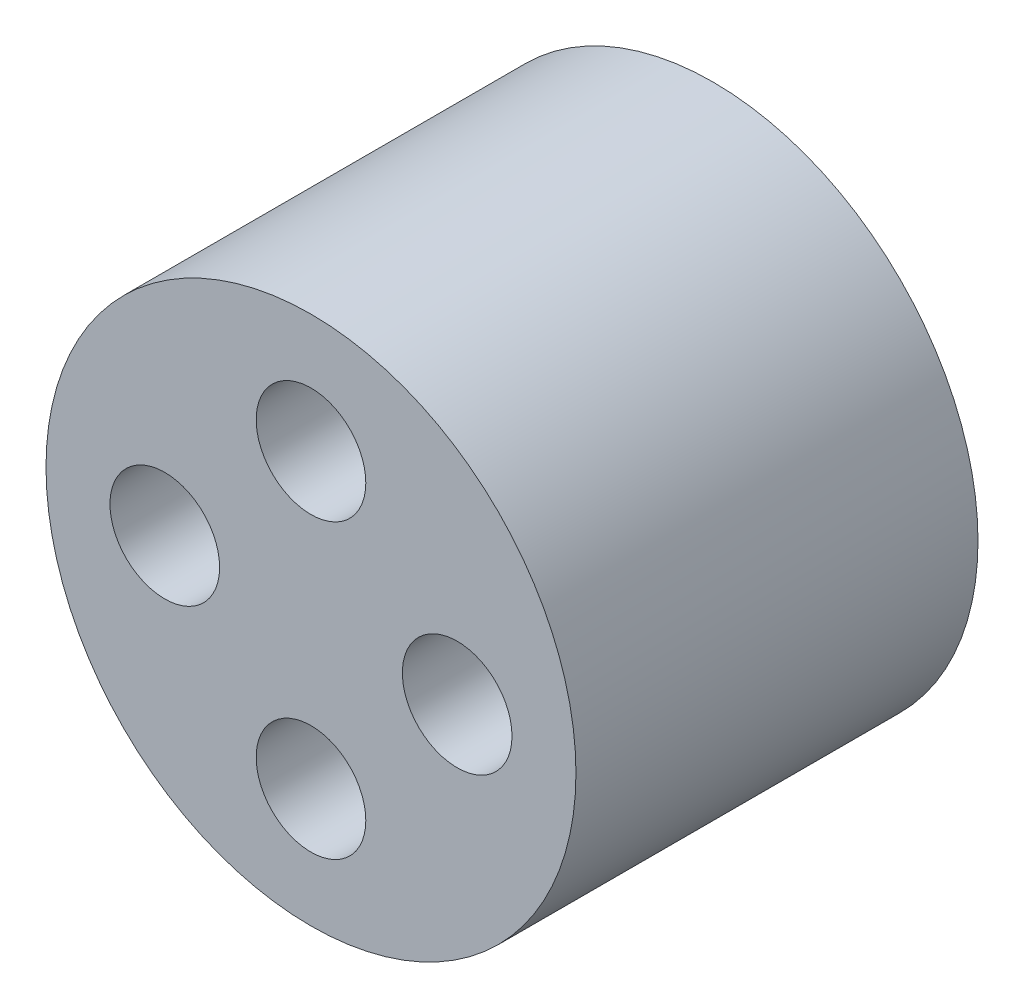
ISO-10303-21;
HEADER;
FILE_DESCRIPTION(('STEP AP214'),'2;1');
FILE_NAME('part.step','',(''),(''),'','','');
FILE_SCHEMA(('AUTOMOTIVE_DESIGN { 1 0 10303 214 1 1 1 1 }'));
ENDSEC;
DATA;
#1=APPLICATION_CONTEXT('core data for automotive mechanical design processes');
#2=APPLICATION_PROTOCOL_DEFINITION('international standard','automotive_design',2000,#1);
#3=PRODUCT_CONTEXT('',#1,'mechanical');
#4=PRODUCT('Part','Part','',(#3));
#5=PRODUCT_RELATED_PRODUCT_CATEGORY('part','',(#4));
#6=PRODUCT_DEFINITION_FORMATION('','',#4);
#7=PRODUCT_DEFINITION_CONTEXT('part definition',#1,'design');
#8=PRODUCT_DEFINITION('design','',#6,#7);
#9=PRODUCT_DEFINITION_SHAPE('','',#8);
#10=(LENGTH_UNIT() NAMED_UNIT(*) SI_UNIT(.MILLI.,.METRE.));
#11=(NAMED_UNIT(*) PLANE_ANGLE_UNIT() SI_UNIT($,.RADIAN.));
#12=(NAMED_UNIT(*) SI_UNIT($,.STERADIAN.) SOLID_ANGLE_UNIT());
#13=UNCERTAINTY_MEASURE_WITH_UNIT(LENGTH_MEASURE(1.E-05),#10,'distance_accuracy_value','');
#14=(GEOMETRIC_REPRESENTATION_CONTEXT(3) GLOBAL_UNCERTAINTY_ASSIGNED_CONTEXT((#13)) GLOBAL_UNIT_ASSIGNED_CONTEXT((#10,
#11,#12)) REPRESENTATION_CONTEXT('',''));
#15=CARTESIAN_POINT('',(0.,0.,0.));
#16=DIRECTION('',(0.,0.,1.));
#17=DIRECTION('',(1.,0.,0.));
#18=AXIS2_PLACEMENT_3D('',#15,#16,#17);
#19=CARTESIAN_POINT('',(-8.,0.,22.));
#20=DIRECTION('',(0.,0.,-1.));
#21=DIRECTION('',(-1.,0.,0.));
#22=AXIS2_PLACEMENT_3D('',#19,#20,#21);
#23=CYLINDRICAL_SURFACE('',#22,1.5);
#24=CARTESIAN_POINT('',(-8.,0.,0.));
#25=DIRECTION('',(0.,0.,1.));
#26=DIRECTION('',(1.,0.,0.));
#27=AXIS2_PLACEMENT_3D('',#24,#25,#26);
#28=CIRCLE('',#27,1.5);
#29=CARTESIAN_POINT('',(-6.5,0.,0.));
#30=VERTEX_POINT('',#29);
#31=EDGE_CURVE('E54',#30,#30,#28,.T.);
#32=ORIENTED_EDGE('',*,*,#31,.F.);
#33=EDGE_LOOP('',(#32));
#34=FACE_BOUND('',#33,.T.);
#35=CARTESIAN_POINT('',(-8.,0.,5.));
#36=DIRECTION('',(0.,0.,1.));
#37=DIRECTION('',(1.,0.,0.));
#38=AXIS2_PLACEMENT_3D('',#35,#36,#37);
#39=CIRCLE('',#38,1.5);
#40=CARTESIAN_POINT('',(-6.5,0.,5.));
#41=VERTEX_POINT('',#40);
#42=EDGE_CURVE('E45',#41,#41,#39,.T.);
#43=ORIENTED_EDGE('',*,*,#42,.T.);
#44=EDGE_LOOP('',(#43));
#45=FACE_BOUND('',#44,.T.);
#46=ADVANCED_FACE('F41',(#34,#45),#23,.F.);
#47=CARTESIAN_POINT('',(0.,-8.,22.));
#48=DIRECTION('',(0.,0.,-1.));
#49=DIRECTION('',(-1.,0.,0.));
#50=AXIS2_PLACEMENT_3D('',#47,#48,#49);
#51=CYLINDRICAL_SURFACE('',#50,1.5);
#52=CARTESIAN_POINT('',(0.,-8.,0.));
#53=DIRECTION('',(0.,0.,1.));
#54=DIRECTION('',(1.,0.,0.));
#55=AXIS2_PLACEMENT_3D('',#52,#53,#54);
#56=CIRCLE('',#55,1.5);
#57=CARTESIAN_POINT('',(1.49999999999997,-8.,0.));
#58=VERTEX_POINT('',#57);
#59=EDGE_CURVE('E66',#58,#58,#56,.T.);
#60=ORIENTED_EDGE('',*,*,#59,.F.);
#61=EDGE_LOOP('',(#60));
#62=FACE_BOUND('',#61,.T.);
#63=CARTESIAN_POINT('',(0.,-8.,5.));
#64=DIRECTION('',(0.,0.,1.));
#65=DIRECTION('',(1.,0.,0.));
#66=AXIS2_PLACEMENT_3D('',#63,#64,#65);
#67=CIRCLE('',#66,1.5);
#68=CARTESIAN_POINT('',(1.49999999999997,-8.,5.));
#69=VERTEX_POINT('',#68);
#70=EDGE_CURVE('E77',#69,#69,#67,.T.);
#71=ORIENTED_EDGE('',*,*,#70,.T.);
#72=EDGE_LOOP('',(#71));
#73=FACE_BOUND('',#72,.T.);
#74=ADVANCED_FACE('F138',(#62,#73),#51,.F.);
#75=CARTESIAN_POINT('',(8.,0.,22.));
#76=DIRECTION('',(0.,0.,-1.));
#77=DIRECTION('',(-1.,0.,0.));
#78=AXIS2_PLACEMENT_3D('',#75,#76,#77);
#79=CYLINDRICAL_SURFACE('',#78,1.5);
#80=CARTESIAN_POINT('',(8.,0.,0.));
#81=DIRECTION('',(0.,0.,1.));
#82=DIRECTION('',(1.,0.,0.));
#83=AXIS2_PLACEMENT_3D('',#80,#81,#82);
#84=CIRCLE('',#83,1.5);
#85=CARTESIAN_POINT('',(9.5,0.,0.));
#86=VERTEX_POINT('',#85);
#87=EDGE_CURVE('E63',#86,#86,#84,.T.);
#88=ORIENTED_EDGE('',*,*,#87,.F.);
#89=EDGE_LOOP('',(#88));
#90=FACE_BOUND('',#89,.T.);
#91=CARTESIAN_POINT('',(8.,0.,5.));
#92=DIRECTION('',(0.,0.,1.));
#93=DIRECTION('',(1.,0.,0.));
#94=AXIS2_PLACEMENT_3D('',#91,#92,#93);
#95=CIRCLE('',#94,1.5);
#96=CARTESIAN_POINT('',(9.5,0.,5.));
#97=VERTEX_POINT('',#96);
#98=EDGE_CURVE('E74',#97,#97,#95,.T.);
#99=ORIENTED_EDGE('',*,*,#98,.T.);
#100=EDGE_LOOP('',(#99));
#101=FACE_BOUND('',#100,.T.);
#102=ADVANCED_FACE('F144',(#90,#101),#79,.F.);
#103=CARTESIAN_POINT('',(0.,8.,22.));
#104=DIRECTION('',(0.,0.,-1.));
#105=DIRECTION('',(-1.,0.,0.));
#106=AXIS2_PLACEMENT_3D('',#103,#104,#105);
#107=CYLINDRICAL_SURFACE('',#106,1.5);
#108=CARTESIAN_POINT('',(0.,8.,0.));
#109=DIRECTION('',(0.,0.,1.));
#110=DIRECTION('',(1.,0.,0.));
#111=AXIS2_PLACEMENT_3D('',#108,#109,#110);
#112=CIRCLE('',#111,1.5);
#113=CARTESIAN_POINT('',(1.50000000000008,8.,0.));
#114=VERTEX_POINT('',#113);
#115=EDGE_CURVE('E60',#114,#114,#112,.T.);
#116=ORIENTED_EDGE('',*,*,#115,.F.);
#117=EDGE_LOOP('',(#116));
#118=FACE_BOUND('',#117,.T.);
#119=CARTESIAN_POINT('',(0.,8.,5.));
#120=DIRECTION('',(0.,0.,1.));
#121=DIRECTION('',(1.,0.,0.));
#122=AXIS2_PLACEMENT_3D('',#119,#120,#121);
#123=CIRCLE('',#122,1.5);
#124=CARTESIAN_POINT('',(1.50000000000008,8.,5.));
#125=VERTEX_POINT('',#124);
#126=EDGE_CURVE('E71',#125,#125,#123,.T.);
#127=ORIENTED_EDGE('',*,*,#126,.T.);
#128=EDGE_LOOP('',(#127));
#129=FACE_BOUND('',#128,.T.);
#130=ADVANCED_FACE('F43',(#118,#129),#107,.F.);
#131=CARTESIAN_POINT('',(0.,0.,22.));
#132=DIRECTION('',(0.,0.,-1.));
#133=DIRECTION('',(-1.,0.,0.));
#134=AXIS2_PLACEMENT_3D('',#131,#132,#133);
#135=CYLINDRICAL_SURFACE('',#134,14.5);
#136=CARTESIAN_POINT('',(0.,0.,22.));
#137=DIRECTION('',(0.,0.,1.));
#138=DIRECTION('',(1.,0.,0.));
#139=AXIS2_PLACEMENT_3D('',#136,#137,#138);
#140=CIRCLE('',#139,14.5);
#141=CARTESIAN_POINT('',(14.5,0.,22.));
#142=VERTEX_POINT('',#141);
#143=EDGE_CURVE('E11',#142,#142,#140,.T.);
#144=ORIENTED_EDGE('',*,*,#143,.F.);
#145=EDGE_LOOP('',(#144));
#146=FACE_BOUND('',#145,.T.);
#147=CARTESIAN_POINT('',(0.,0.,0.));
#148=DIRECTION('',(0.,0.,1.));
#149=DIRECTION('',(1.,0.,0.));
#150=AXIS2_PLACEMENT_3D('',#147,#148,#149);
#151=CIRCLE('',#150,14.5);
#152=CARTESIAN_POINT('',(14.5,0.,0.));
#153=VERTEX_POINT('',#152);
#154=EDGE_CURVE('E49',#153,#153,#151,.T.);
#155=ORIENTED_EDGE('',*,*,#154,.T.);
#156=EDGE_LOOP('',(#155));
#157=FACE_BOUND('',#156,.T.);
#158=ADVANCED_FACE('F121',(#146,#157),#135,.T.);
#159=CARTESIAN_POINT('',(0.,0.,22.));
#160=DIRECTION('',(0.,0.,1.));
#161=DIRECTION('',(1.,0.,0.));
#162=AXIS2_PLACEMENT_3D('',#159,#160,#161);
#163=PLANE('',#162);
#164=CARTESIAN_POINT('',(0.,8.,22.));
#165=DIRECTION('',(0.,0.,1.));
#166=DIRECTION('',(1.,0.,0.));
#167=AXIS2_PLACEMENT_3D('',#164,#165,#166);
#168=CIRCLE('',#167,3.);
#169=CARTESIAN_POINT('',(3.00000000000008,8.,22.));
#170=VERTEX_POINT('',#169);
#171=EDGE_CURVE('E107',#170,#170,#168,.T.);
#172=ORIENTED_EDGE('',*,*,#171,.F.);
#173=EDGE_LOOP('',(#172));
#174=FACE_BOUND('',#173,.T.);
#175=CARTESIAN_POINT('',(8.,-1.1172740284298E-13,22.));
#176=DIRECTION('',(0.,0.,1.));
#177=DIRECTION('',(1.,0.,0.));
#178=AXIS2_PLACEMENT_3D('',#175,#176,#177);
#179=CIRCLE('',#178,3.);
#180=CARTESIAN_POINT('',(11.,-1.1172740284298E-13,22.));
#181=VERTEX_POINT('',#180);
#182=EDGE_CURVE('E104',#181,#181,#179,.T.);
#183=ORIENTED_EDGE('',*,*,#182,.F.);
#184=EDGE_LOOP('',(#183));
#185=FACE_BOUND('',#184,.T.);
#186=CARTESIAN_POINT('',(-1.39659253553725E-13,-8.,22.));
#187=DIRECTION('',(0.,0.,1.));
#188=DIRECTION('',(1.,0.,0.));
#189=AXIS2_PLACEMENT_3D('',#186,#187,#188);
#190=CIRCLE('',#189,3.);
#191=CARTESIAN_POINT('',(2.99999999999986,-8.,22.));
#192=VERTEX_POINT('',#191);
#193=EDGE_CURVE('E98',#192,#192,#190,.T.);
#194=ORIENTED_EDGE('',*,*,#193,.F.);
#195=EDGE_LOOP('',(#194));
#196=FACE_BOUND('',#195,.T.);
#197=CARTESIAN_POINT('',(-8.,1.69325827740447E-13,22.));
#198=DIRECTION('',(0.,0.,1.));
#199=DIRECTION('',(1.,0.,0.));
#200=AXIS2_PLACEMENT_3D('',#197,#198,#199);
#201=CIRCLE('',#200,3.);
#202=CARTESIAN_POINT('',(-5.,1.69325827740447E-13,22.));
#203=VERTEX_POINT('',#202);
#204=EDGE_CURVE('E58',#203,#203,#201,.T.);
#205=ORIENTED_EDGE('',*,*,#204,.F.);
#206=EDGE_LOOP('',(#205));
#207=FACE_BOUND('',#206,.T.);
#208=ORIENTED_EDGE('',*,*,#143,.T.);
#209=EDGE_LOOP('',(#208));
#210=FACE_BOUND('',#209,.T.);
#211=ADVANCED_FACE('F117',(#174,#185,#196,#207,#210),#163,.T.);
#212=CARTESIAN_POINT('',(0.,0.,0.));
#213=DIRECTION('',(0.,0.,1.));
#214=DIRECTION('',(1.,0.,0.));
#215=AXIS2_PLACEMENT_3D('',#212,#213,#214);
#216=PLANE('',#215);
#217=ORIENTED_EDGE('',*,*,#115,.T.);
#218=EDGE_LOOP('',(#217));
#219=FACE_BOUND('',#218,.T.);
#220=ORIENTED_EDGE('',*,*,#87,.T.);
#221=EDGE_LOOP('',(#220));
#222=FACE_BOUND('',#221,.T.);
#223=ORIENTED_EDGE('',*,*,#59,.T.);
#224=EDGE_LOOP('',(#223));
#225=FACE_BOUND('',#224,.T.);
#226=ORIENTED_EDGE('',*,*,#31,.T.);
#227=EDGE_LOOP('',(#226));
#228=FACE_BOUND('',#227,.T.);
#229=ORIENTED_EDGE('',*,*,#154,.F.);
#230=EDGE_LOOP('',(#229));
#231=FACE_BOUND('',#230,.T.);
#232=ADVANCED_FACE('F120',(#219,#222,#225,#228,#231),#216,.F.);
#233=CARTESIAN_POINT('',(-8.,1.69325827740447E-13,-8.48528137423857));
#234=DIRECTION('',(0.,0.,1.));
#235=DIRECTION('',(1.,0.,0.));
#236=AXIS2_PLACEMENT_3D('',#233,#234,#235);
#237=CYLINDRICAL_SURFACE('',#236,3.);
#238=CARTESIAN_POINT('',(-8.,1.69325827740447E-13,5.));
#239=DIRECTION('',(0.,0.,1.));
#240=DIRECTION('',(1.,0.,0.));
#241=AXIS2_PLACEMENT_3D('',#238,#239,#240);
#242=CIRCLE('',#241,3.);
#243=CARTESIAN_POINT('',(-5.,1.69325827740447E-13,5.));
#244=VERTEX_POINT('',#243);
#245=EDGE_CURVE('E93',#244,#244,#242,.F.);
#246=ORIENTED_EDGE('',*,*,#245,.T.);
#247=EDGE_LOOP('',(#246));
#248=FACE_BOUND('',#247,.T.);
#249=ORIENTED_EDGE('',*,*,#204,.T.);
#250=EDGE_LOOP('',(#249));
#251=FACE_BOUND('',#250,.T.);
#252=ADVANCED_FACE('F89',(#248,#251),#237,.F.);
#253=CARTESIAN_POINT('',(0.,0.,5.));
#254=DIRECTION('',(0.,0.,1.));
#255=DIRECTION('',(1.,0.,0.));
#256=AXIS2_PLACEMENT_3D('',#253,#254,#255);
#257=PLANE('',#256);
#258=ORIENTED_EDGE('',*,*,#42,.F.);
#259=EDGE_LOOP('',(#258));
#260=FACE_BOUND('',#259,.T.);
#261=ORIENTED_EDGE('',*,*,#245,.F.);
#262=EDGE_LOOP('',(#261));
#263=FACE_BOUND('',#262,.T.);
#264=ADVANCED_FACE('F85',(#260,#263),#257,.T.);
#265=CARTESIAN_POINT('',(-1.39659253553725E-13,-8.,-8.48528137423857));
#266=DIRECTION('',(0.,0.,1.));
#267=DIRECTION('',(1.,0.,0.));
#268=AXIS2_PLACEMENT_3D('',#265,#266,#267);
#269=CYLINDRICAL_SURFACE('',#268,3.);
#270=CARTESIAN_POINT('',(-1.39659253553725E-13,-8.,5.));
#271=DIRECTION('',(0.,0.,1.));
#272=DIRECTION('',(1.,0.,0.));
#273=AXIS2_PLACEMENT_3D('',#270,#271,#272);
#274=CIRCLE('',#273,3.);
#275=CARTESIAN_POINT('',(2.99999999999986,-8.,5.));
#276=VERTEX_POINT('',#275);
#277=EDGE_CURVE('E96',#276,#276,#274,.F.);
#278=ORIENTED_EDGE('',*,*,#277,.T.);
#279=EDGE_LOOP('',(#278));
#280=FACE_BOUND('',#279,.T.);
#281=ORIENTED_EDGE('',*,*,#193,.T.);
#282=EDGE_LOOP('',(#281));
#283=FACE_BOUND('',#282,.T.);
#284=ADVANCED_FACE('F88',(#280,#283),#269,.F.);
#285=CARTESIAN_POINT('',(0.,0.,5.));
#286=DIRECTION('',(0.,0.,1.));
#287=DIRECTION('',(1.,0.,0.));
#288=AXIS2_PLACEMENT_3D('',#285,#286,#287);
#289=PLANE('',#288);
#290=ORIENTED_EDGE('',*,*,#70,.F.);
#291=EDGE_LOOP('',(#290));
#292=FACE_BOUND('',#291,.T.);
#293=ORIENTED_EDGE('',*,*,#277,.F.);
#294=EDGE_LOOP('',(#293));
#295=FACE_BOUND('',#294,.T.);
#296=ADVANCED_FACE('F168',(#292,#295),#289,.T.);
#297=CARTESIAN_POINT('',(8.,-1.1172740284298E-13,-8.48528137423857));
#298=DIRECTION('',(0.,0.,1.));
#299=DIRECTION('',(1.,0.,0.));
#300=AXIS2_PLACEMENT_3D('',#297,#298,#299);
#301=CYLINDRICAL_SURFACE('',#300,3.);
#302=CARTESIAN_POINT('',(8.,-1.1172740284298E-13,5.));
#303=DIRECTION('',(0.,0.,1.));
#304=DIRECTION('',(1.,0.,0.));
#305=AXIS2_PLACEMENT_3D('',#302,#303,#304);
#306=CIRCLE('',#305,3.);
#307=CARTESIAN_POINT('',(11.,-1.1172740284298E-13,5.));
#308=VERTEX_POINT('',#307);
#309=EDGE_CURVE('E101',#308,#308,#306,.F.);
#310=ORIENTED_EDGE('',*,*,#309,.T.);
#311=EDGE_LOOP('',(#310));
#312=FACE_BOUND('',#311,.T.);
#313=ORIENTED_EDGE('',*,*,#182,.T.);
#314=EDGE_LOOP('',(#313));
#315=FACE_BOUND('',#314,.T.);
#316=ADVANCED_FACE('F162',(#312,#315),#301,.F.);
#317=CARTESIAN_POINT('',(0.,0.,5.));
#318=DIRECTION('',(0.,0.,1.));
#319=DIRECTION('',(1.,0.,0.));
#320=AXIS2_PLACEMENT_3D('',#317,#318,#319);
#321=PLANE('',#320);
#322=ORIENTED_EDGE('',*,*,#98,.F.);
#323=EDGE_LOOP('',(#322));
#324=FACE_BOUND('',#323,.T.);
#325=ORIENTED_EDGE('',*,*,#309,.F.);
#326=EDGE_LOOP('',(#325));
#327=FACE_BOUND('',#326,.T.);
#328=ADVANCED_FACE('F159',(#324,#327),#321,.T.);
#329=CARTESIAN_POINT('',(0.,8.,-8.48528137423857));
#330=DIRECTION('',(0.,0.,1.));
#331=DIRECTION('',(1.,0.,0.));
#332=AXIS2_PLACEMENT_3D('',#329,#330,#331);
#333=CYLINDRICAL_SURFACE('',#332,3.);
#334=CARTESIAN_POINT('',(0.,8.,5.));
#335=DIRECTION('',(0.,0.,1.));
#336=DIRECTION('',(1.,0.,0.));
#337=AXIS2_PLACEMENT_3D('',#334,#335,#336);
#338=CIRCLE('',#337,3.);
#339=CARTESIAN_POINT('',(3.00000000000008,8.,5.));
#340=VERTEX_POINT('',#339);
#341=EDGE_CURVE('E75',#340,#340,#338,.F.);
#342=ORIENTED_EDGE('',*,*,#341,.T.);
#343=EDGE_LOOP('',(#342));
#344=FACE_BOUND('',#343,.T.);
#345=ORIENTED_EDGE('',*,*,#171,.T.);
#346=EDGE_LOOP('',(#345));
#347=FACE_BOUND('',#346,.T.);
#348=ADVANCED_FACE('F115',(#344,#347),#333,.F.);
#349=CARTESIAN_POINT('',(0.,0.,5.));
#350=DIRECTION('',(0.,0.,1.));
#351=DIRECTION('',(1.,0.,0.));
#352=AXIS2_PLACEMENT_3D('',#349,#350,#351);
#353=PLANE('',#352);
#354=ORIENTED_EDGE('',*,*,#126,.F.);
#355=EDGE_LOOP('',(#354));
#356=FACE_BOUND('',#355,.T.);
#357=ORIENTED_EDGE('',*,*,#341,.F.);
#358=EDGE_LOOP('',(#357));
#359=FACE_BOUND('',#358,.T.);
#360=ADVANCED_FACE('F211',(#356,#359),#353,.T.);
#361=CLOSED_SHELL('',(#46,#74,#102,#130,#158,#211,#232,#252,#264,#284,#296,#316,#328,#348,#360));
#362=MANIFOLD_SOLID_BREP('B2',#361);
#363=ADVANCED_BREP_SHAPE_REPRESENTATION('',(#18,#362),#14);
#364=SHAPE_DEFINITION_REPRESENTATION(#9,#363);
ENDSEC;
END-ISO-10303-21;
